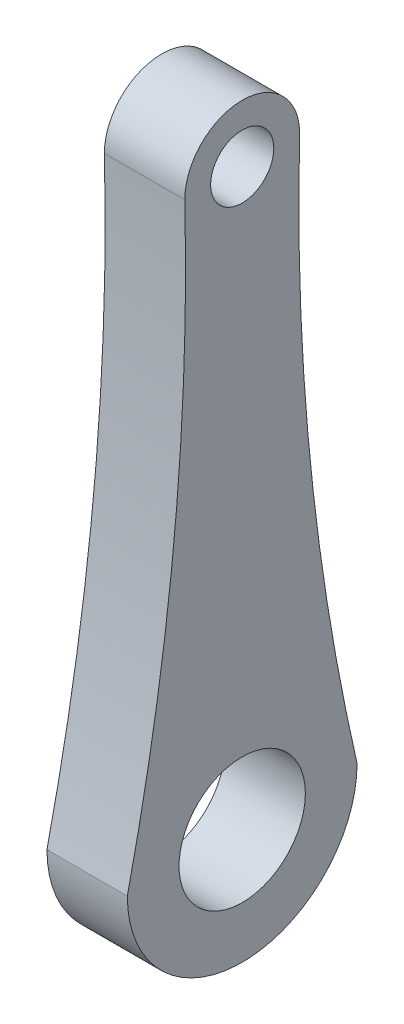
ISO-10303-21;
HEADER;
FILE_DESCRIPTION(('STEP AP214'),'2;1');
FILE_NAME('part.step','',(''),(''),'','','');
FILE_SCHEMA(('AUTOMOTIVE_DESIGN { 1 0 10303 214 1 1 1 1 }'));
ENDSEC;
DATA;
#1=APPLICATION_CONTEXT('core data for automotive mechanical design processes');
#2=APPLICATION_PROTOCOL_DEFINITION('international standard','automotive_design',2000,#1);
#3=PRODUCT_CONTEXT('',#1,'mechanical');
#4=PRODUCT('Part','Part','',(#3));
#5=PRODUCT_RELATED_PRODUCT_CATEGORY('part','',(#4));
#6=PRODUCT_DEFINITION_FORMATION('','',#4);
#7=PRODUCT_DEFINITION_CONTEXT('part definition',#1,'design');
#8=PRODUCT_DEFINITION('design','',#6,#7);
#9=PRODUCT_DEFINITION_SHAPE('','',#8);
#10=(LENGTH_UNIT() NAMED_UNIT(*) SI_UNIT(.MILLI.,.METRE.));
#11=(NAMED_UNIT(*) PLANE_ANGLE_UNIT() SI_UNIT($,.RADIAN.));
#12=(NAMED_UNIT(*) SI_UNIT($,.STERADIAN.) SOLID_ANGLE_UNIT());
#13=UNCERTAINTY_MEASURE_WITH_UNIT(LENGTH_MEASURE(1.E-05),#10,'distance_accuracy_value','');
#14=(GEOMETRIC_REPRESENTATION_CONTEXT(3) GLOBAL_UNCERTAINTY_ASSIGNED_CONTEXT((#13)) GLOBAL_UNIT_ASSIGNED_CONTEXT((#10,
#11,#12)) REPRESENTATION_CONTEXT('',''));
#15=CARTESIAN_POINT('',(0.,0.,0.));
#16=DIRECTION('',(0.,0.,1.));
#17=DIRECTION('',(1.,0.,0.));
#18=AXIS2_PLACEMENT_3D('',#15,#16,#17);
#19=CARTESIAN_POINT('',(7.,44.7430900307018,-204.930900307018));
#20=DIRECTION('',(-1.,0.,0.));
#21=DIRECTION('',(0.,0.,1.));
#22=AXIS2_PLACEMENT_3D('',#19,#20,#21);
#23=CYLINDRICAL_SURFACE('',#22,200.);
#24=CARTESIAN_POINT('',(0.,44.7430900307018,-204.930900307018));
#25=DIRECTION('',(1.,0.,0.));
#26=DIRECTION('',(0.,0.,-1.));
#27=AXIS2_PLACEMENT_3D('',#24,#25,#26);
#28=CIRCLE('',#27,200.);
#29=CARTESIAN_POINT('',(0.,49.9999999999993,-5.));
#30=VERTEX_POINT('',#29);
#31=CARTESIAN_POINT('',(0.,0.,-10.));
#32=VERTEX_POINT('',#31);
#33=EDGE_CURVE('E108',#30,#32,#28,.T.);
#34=ORIENTED_EDGE('',*,*,#33,.F.);
#35=DIRECTION('',(-1.,0.,0.));
#36=VECTOR('',#35,1.);
#37=CARTESIAN_POINT('',(7.,49.9999999999993,-5.));
#38=LINE('',#37,#36);
#39=CARTESIAN_POINT('',(7.,49.9999999999993,-5.));
#40=VERTEX_POINT('',#39);
#41=EDGE_CURVE('E11',#40,#30,#38,.T.);
#42=ORIENTED_EDGE('',*,*,#41,.F.);
#43=CARTESIAN_POINT('',(7.,44.7430900307018,-204.930900307018));
#44=DIRECTION('',(1.,0.,0.));
#45=DIRECTION('',(0.,0.,-1.));
#46=AXIS2_PLACEMENT_3D('',#43,#44,#45);
#47=CIRCLE('',#46,200.);
#48=CARTESIAN_POINT('',(7.,0.,-10.));
#49=VERTEX_POINT('',#48);
#50=EDGE_CURVE('E92',#40,#49,#47,.T.);
#51=ORIENTED_EDGE('',*,*,#50,.T.);
#52=DIRECTION('',(-1.,0.,0.));
#53=VECTOR('',#52,1.);
#54=CARTESIAN_POINT('',(7.,0.,-10.));
#55=LINE('',#54,#53);
#56=EDGE_CURVE('E81',#49,#32,#55,.T.);
#57=ORIENTED_EDGE('',*,*,#56,.T.);
#58=EDGE_LOOP('',(#34,#42,#51,#57));
#59=FACE_BOUND('',#58,.T.);
#60=ADVANCED_FACE('F41',(#59),#23,.F.);
#61=CARTESIAN_POINT('',(7.,50.,0.));
#62=DIRECTION('',(-1.,0.,0.));
#63=DIRECTION('',(0.,0.,1.));
#64=AXIS2_PLACEMENT_3D('',#61,#62,#63);
#65=CYLINDRICAL_SURFACE('',#64,5.);
#66=CARTESIAN_POINT('',(0.,50.,0.));
#67=DIRECTION('',(1.,0.,0.));
#68=DIRECTION('',(0.,0.,-1.));
#69=AXIS2_PLACEMENT_3D('',#66,#67,#68);
#70=CIRCLE('',#69,5.);
#71=CARTESIAN_POINT('',(0.,49.9999999999993,5.));
#72=VERTEX_POINT('',#71);
#73=EDGE_CURVE('E98',#30,#72,#70,.T.);
#74=ORIENTED_EDGE('',*,*,#73,.T.);
#75=DIRECTION('',(-1.,0.,0.));
#76=VECTOR('',#75,1.);
#77=CARTESIAN_POINT('',(7.,49.9999999999993,5.));
#78=LINE('',#77,#76);
#79=CARTESIAN_POINT('',(7.,49.9999999999993,5.));
#80=VERTEX_POINT('',#79);
#81=EDGE_CURVE('E50',#80,#72,#78,.T.);
#82=ORIENTED_EDGE('',*,*,#81,.F.);
#83=CARTESIAN_POINT('',(7.,50.,0.));
#84=DIRECTION('',(1.,0.,0.));
#85=DIRECTION('',(0.,0.,-1.));
#86=AXIS2_PLACEMENT_3D('',#83,#84,#85);
#87=CIRCLE('',#86,5.);
#88=EDGE_CURVE('E87',#40,#80,#87,.T.);
#89=ORIENTED_EDGE('',*,*,#88,.F.);
#90=ORIENTED_EDGE('',*,*,#41,.T.);
#91=EDGE_LOOP('',(#74,#82,#89,#90));
#92=FACE_BOUND('',#91,.T.);
#93=ADVANCED_FACE('F96',(#92),#65,.T.);
#94=CARTESIAN_POINT('',(7.,44.7430900307018,204.930900307018));
#95=DIRECTION('',(-1.,0.,0.));
#96=DIRECTION('',(0.,0.,1.));
#97=AXIS2_PLACEMENT_3D('',#94,#95,#96);
#98=CYLINDRICAL_SURFACE('',#97,200.);
#99=CARTESIAN_POINT('',(0.,44.7430900307018,204.930900307018));
#100=DIRECTION('',(1.,0.,0.));
#101=DIRECTION('',(0.,0.,-1.));
#102=AXIS2_PLACEMENT_3D('',#99,#100,#101);
#103=CIRCLE('',#102,200.);
#104=CARTESIAN_POINT('',(0.,0.,10.));
#105=VERTEX_POINT('',#104);
#106=EDGE_CURVE('E74',#72,#105,#103,.F.);
#107=ORIENTED_EDGE('',*,*,#106,.T.);
#108=DIRECTION('',(-1.,0.,0.));
#109=VECTOR('',#108,1.);
#110=CARTESIAN_POINT('',(7.,0.,10.));
#111=LINE('',#110,#109);
#112=CARTESIAN_POINT('',(7.,0.,10.));
#113=VERTEX_POINT('',#112);
#114=EDGE_CURVE('E100',#113,#105,#111,.T.);
#115=ORIENTED_EDGE('',*,*,#114,.F.);
#116=CARTESIAN_POINT('',(7.,44.7430900307018,204.930900307018));
#117=DIRECTION('',(1.,0.,0.));
#118=DIRECTION('',(0.,0.,-1.));
#119=AXIS2_PLACEMENT_3D('',#116,#117,#118);
#120=CIRCLE('',#119,200.);
#121=EDGE_CURVE('E91',#80,#113,#120,.F.);
#122=ORIENTED_EDGE('',*,*,#121,.F.);
#123=ORIENTED_EDGE('',*,*,#81,.T.);
#124=EDGE_LOOP('',(#107,#115,#122,#123));
#125=FACE_BOUND('',#124,.T.);
#126=ADVANCED_FACE('F101',(#125),#98,.F.);
#127=CARTESIAN_POINT('',(7.,0.,0.));
#128=DIRECTION('',(-1.,0.,0.));
#129=DIRECTION('',(0.,0.,1.));
#130=AXIS2_PLACEMENT_3D('',#127,#128,#129);
#131=CYLINDRICAL_SURFACE('',#130,10.);
#132=CARTESIAN_POINT('',(0.,0.,0.));
#133=DIRECTION('',(1.,0.,0.));
#134=DIRECTION('',(0.,0.,-1.));
#135=AXIS2_PLACEMENT_3D('',#132,#133,#134);
#136=CIRCLE('',#135,10.);
#137=EDGE_CURVE('E117',#105,#32,#136,.T.);
#138=ORIENTED_EDGE('',*,*,#137,.T.);
#139=ORIENTED_EDGE('',*,*,#56,.F.);
#140=CARTESIAN_POINT('',(7.,0.,0.));
#141=DIRECTION('',(1.,0.,0.));
#142=DIRECTION('',(0.,0.,-1.));
#143=AXIS2_PLACEMENT_3D('',#140,#141,#142);
#144=CIRCLE('',#143,10.);
#145=EDGE_CURVE('E58',#113,#49,#144,.T.);
#146=ORIENTED_EDGE('',*,*,#145,.F.);
#147=ORIENTED_EDGE('',*,*,#114,.T.);
#148=EDGE_LOOP('',(#138,#139,#146,#147));
#149=FACE_BOUND('',#148,.T.);
#150=ADVANCED_FACE('F125',(#149),#131,.T.);
#151=CARTESIAN_POINT('',(7.,0.,0.));
#152=DIRECTION('',(1.,0.,0.));
#153=DIRECTION('',(0.,0.,-1.));
#154=AXIS2_PLACEMENT_3D('',#151,#152,#153);
#155=PLANE('',#154);
#156=CARTESIAN_POINT('',(7.,50.,0.));
#157=DIRECTION('',(1.,0.,0.));
#158=DIRECTION('',(0.,0.,-1.));
#159=AXIS2_PLACEMENT_3D('',#156,#157,#158);
#160=CIRCLE('',#159,2.74999999999995);
#161=CARTESIAN_POINT('',(7.,50.,-2.74999999999995));
#162=VERTEX_POINT('',#161);
#163=EDGE_CURVE('E160',#162,#162,#160,.T.);
#164=ORIENTED_EDGE('',*,*,#163,.F.);
#165=EDGE_LOOP('',(#164));
#166=FACE_BOUND('',#165,.T.);
#167=CARTESIAN_POINT('',(7.,0.,0.));
#168=DIRECTION('',(1.,0.,0.));
#169=DIRECTION('',(0.,0.,-1.));
#170=AXIS2_PLACEMENT_3D('',#167,#168,#169);
#171=CIRCLE('',#170,5.49999999999995);
#172=CARTESIAN_POINT('',(7.,0.,-5.49999999999995));
#173=VERTEX_POINT('',#172);
#174=EDGE_CURVE('E164',#173,#173,#171,.T.);
#175=ORIENTED_EDGE('',*,*,#174,.F.);
#176=EDGE_LOOP('',(#175));
#177=FACE_BOUND('',#176,.T.);
#178=ORIENTED_EDGE('',*,*,#50,.F.);
#179=ORIENTED_EDGE('',*,*,#88,.T.);
#180=ORIENTED_EDGE('',*,*,#121,.T.);
#181=ORIENTED_EDGE('',*,*,#145,.T.);
#182=EDGE_LOOP('',(#178,#179,#180,#181));
#183=FACE_BOUND('',#182,.T.);
#184=ADVANCED_FACE('F89',(#166,#177,#183),#155,.T.);
#185=CARTESIAN_POINT('',(0.,0.,0.));
#186=DIRECTION('',(1.,0.,0.));
#187=DIRECTION('',(0.,0.,-1.));
#188=AXIS2_PLACEMENT_3D('',#185,#186,#187);
#189=PLANE('',#188);
#190=CARTESIAN_POINT('',(0.,50.,0.));
#191=DIRECTION('',(1.,0.,0.));
#192=DIRECTION('',(0.,0.,-1.));
#193=AXIS2_PLACEMENT_3D('',#190,#191,#192);
#194=CIRCLE('',#193,2.75);
#195=CARTESIAN_POINT('',(0.,50.,-2.75));
#196=VERTEX_POINT('',#195);
#197=EDGE_CURVE('E157',#196,#196,#194,.T.);
#198=ORIENTED_EDGE('',*,*,#197,.T.);
#199=EDGE_LOOP('',(#198));
#200=FACE_BOUND('',#199,.T.);
#201=CARTESIAN_POINT('',(0.,0.,0.));
#202=DIRECTION('',(1.,0.,0.));
#203=DIRECTION('',(0.,0.,-1.));
#204=AXIS2_PLACEMENT_3D('',#201,#202,#203);
#205=CIRCLE('',#204,5.5);
#206=CARTESIAN_POINT('',(0.,0.,-5.5));
#207=VERTEX_POINT('',#206);
#208=EDGE_CURVE('E112',#207,#207,#205,.T.);
#209=ORIENTED_EDGE('',*,*,#208,.T.);
#210=EDGE_LOOP('',(#209));
#211=FACE_BOUND('',#210,.T.);
#212=ORIENTED_EDGE('',*,*,#33,.T.);
#213=ORIENTED_EDGE('',*,*,#137,.F.);
#214=ORIENTED_EDGE('',*,*,#106,.F.);
#215=ORIENTED_EDGE('',*,*,#73,.F.);
#216=EDGE_LOOP('',(#212,#213,#214,#215));
#217=FACE_BOUND('',#216,.T.);
#218=ADVANCED_FACE('F127',(#200,#211,#217),#189,.F.);
#219=CARTESIAN_POINT('',(7.,0.,0.));
#220=DIRECTION('',(1.,0.,0.));
#221=DIRECTION('',(0.,0.,-1.));
#222=AXIS2_PLACEMENT_3D('',#219,#220,#221);
#223=CYLINDRICAL_SURFACE('',#222,5.49999999999997);
#224=ORIENTED_EDGE('',*,*,#208,.F.);
#225=EDGE_LOOP('',(#224));
#226=FACE_BOUND('',#225,.T.);
#227=ORIENTED_EDGE('',*,*,#174,.T.);
#228=EDGE_LOOP('',(#227));
#229=FACE_BOUND('',#228,.T.);
#230=ADVANCED_FACE('F141',(#226,#229),#223,.F.);
#231=CARTESIAN_POINT('',(7.,50.,0.));
#232=DIRECTION('',(1.,0.,0.));
#233=DIRECTION('',(0.,0.,-1.));
#234=AXIS2_PLACEMENT_3D('',#231,#232,#233);
#235=CYLINDRICAL_SURFACE('',#234,2.74999999999997);
#236=ORIENTED_EDGE('',*,*,#197,.F.);
#237=EDGE_LOOP('',(#236));
#238=FACE_BOUND('',#237,.T.);
#239=ORIENTED_EDGE('',*,*,#163,.T.);
#240=EDGE_LOOP('',(#239));
#241=FACE_BOUND('',#240,.T.);
#242=ADVANCED_FACE('F148',(#238,#241),#235,.F.);
#243=CLOSED_SHELL('',(#60,#93,#126,#150,#184,#218,#230,#242));
#244=MANIFOLD_SOLID_BREP('B2',#243);
#245=ADVANCED_BREP_SHAPE_REPRESENTATION('',(#18,#244),#14);
#246=SHAPE_DEFINITION_REPRESENTATION(#9,#245);
ENDSEC;
END-ISO-10303-21;
